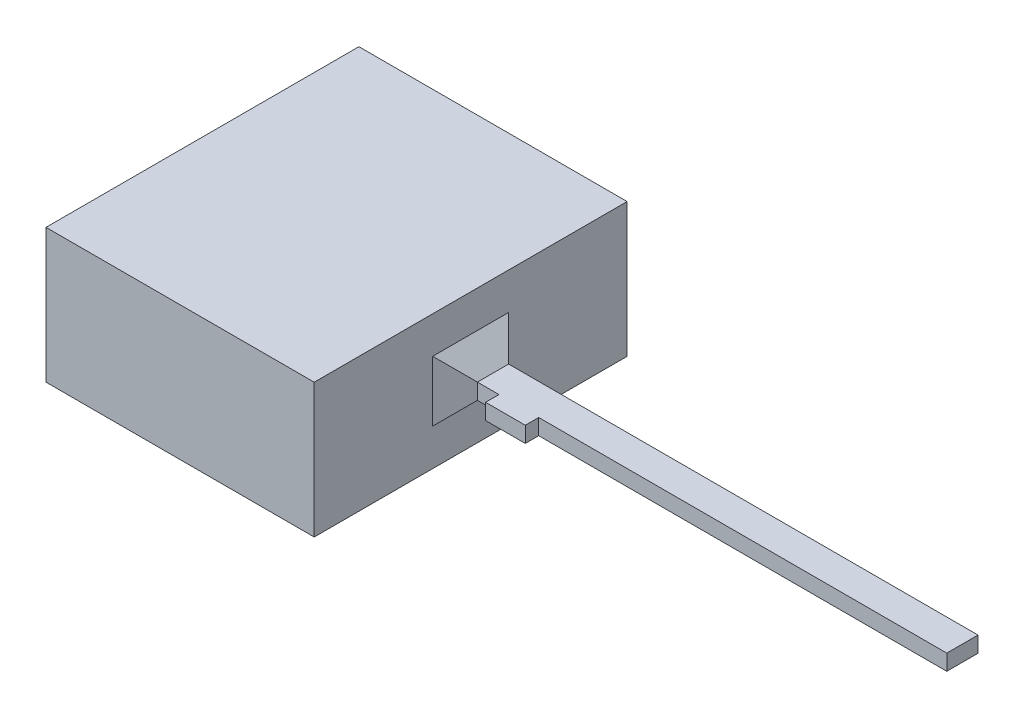
ISO-10303-21;
HEADER;
FILE_DESCRIPTION(('STEP AP214'),'2;1');
FILE_NAME('part.step','',(''),(''),'','','');
FILE_SCHEMA(('AUTOMOTIVE_DESIGN { 1 0 10303 214 1 1 1 1 }'));
ENDSEC;
DATA;
#1=APPLICATION_CONTEXT('core data for automotive mechanical design processes');
#2=APPLICATION_PROTOCOL_DEFINITION('international standard','automotive_design',2000,#1);
#3=PRODUCT_CONTEXT('',#1,'mechanical');
#4=PRODUCT('Part','Part','',(#3));
#5=PRODUCT_RELATED_PRODUCT_CATEGORY('part','',(#4));
#6=PRODUCT_DEFINITION_FORMATION('','',#4);
#7=PRODUCT_DEFINITION_CONTEXT('part definition',#1,'design');
#8=PRODUCT_DEFINITION('design','',#6,#7);
#9=PRODUCT_DEFINITION_SHAPE('','',#8);
#10=(LENGTH_UNIT() NAMED_UNIT(*) SI_UNIT(.MILLI.,.METRE.));
#11=(NAMED_UNIT(*) PLANE_ANGLE_UNIT() SI_UNIT($,.RADIAN.));
#12=(NAMED_UNIT(*) SI_UNIT($,.STERADIAN.) SOLID_ANGLE_UNIT());
#13=UNCERTAINTY_MEASURE_WITH_UNIT(LENGTH_MEASURE(1.E-05),#10,'distance_accuracy_value','');
#14=(GEOMETRIC_REPRESENTATION_CONTEXT(3) GLOBAL_UNCERTAINTY_ASSIGNED_CONTEXT((#13)) GLOBAL_UNIT_ASSIGNED_CONTEXT((#10,
#11,#12)) REPRESENTATION_CONTEXT('',''));
#15=CARTESIAN_POINT('',(0.,0.,0.));
#16=DIRECTION('',(0.,0.,1.));
#17=DIRECTION('',(1.,0.,0.));
#18=AXIS2_PLACEMENT_3D('',#15,#16,#17);
#19=CARTESIAN_POINT('',(14.,1.67667657759325,0.349313412928724));
#20=DIRECTION('',(0.,0.,-1.));
#21=DIRECTION('',(-1.,0.,0.));
#22=AXIS2_PLACEMENT_3D('',#19,#20,#21);
#23=PLANE('',#22);
#24=DIRECTION('',(0.,-1.,0.));
#25=VECTOR('',#24,1.);
#26=CARTESIAN_POINT('',(3.98275374954353,1.67667657759325,0.349313412928724));
#27=LINE('',#26,#25);
#28=CARTESIAN_POINT('',(3.98275374954353,1.67667657759325,0.349313412928724));
#29=VERTEX_POINT('',#28);
#30=CARTESIAN_POINT('',(3.98275374954353,1.32332342240675,0.349313412928724));
#31=VERTEX_POINT('',#30);
#32=EDGE_CURVE('E162',#29,#31,#27,.T.);
#33=ORIENTED_EDGE('',*,*,#32,.F.);
#34=DIRECTION('',(-1.,0.,0.));
#35=VECTOR('',#34,1.);
#36=CARTESIAN_POINT('',(14.,1.67667657759325,0.349313412928724));
#37=LINE('',#36,#35);
#38=CARTESIAN_POINT('',(3.5,1.67667657759325,0.349313412928724));
#39=VERTEX_POINT('',#38);
#40=EDGE_CURVE('E183',#29,#39,#37,.T.);
#41=ORIENTED_EDGE('',*,*,#40,.T.);
#42=DIRECTION('',(0.,-1.,0.));
#43=VECTOR('',#42,1.);
#44=CARTESIAN_POINT('',(3.5,1.32332342240675,0.349313412928724));
#45=LINE('',#44,#43);
#46=CARTESIAN_POINT('',(3.5,1.32332342240675,0.349313412928724));
#47=VERTEX_POINT('',#46);
#48=EDGE_CURVE('E200',#39,#47,#45,.T.);
#49=ORIENTED_EDGE('',*,*,#48,.T.);
#50=DIRECTION('',(-1.,0.,0.));
#51=VECTOR('',#50,1.);
#52=CARTESIAN_POINT('',(14.,1.32332342240675,0.349313412928724));
#53=LINE('',#52,#51);
#54=EDGE_CURVE('E50',#31,#47,#53,.T.);
#55=ORIENTED_EDGE('',*,*,#54,.F.);
#56=EDGE_LOOP('',(#33,#41,#49,#55));
#57=FACE_BOUND('',#56,.T.);
#58=ADVANCED_FACE('F33',(#57),#23,.F.);
#59=CARTESIAN_POINT('',(3.,3.,3.5));
#60=DIRECTION('',(-1.,0.,0.));
#61=DIRECTION('',(0.,0.,1.));
#62=AXIS2_PLACEMENT_3D('',#59,#60,#61);
#63=PLANE('',#62);
#64=DIRECTION('',(0.,0.,-1.));
#65=VECTOR('',#64,1.);
#66=CARTESIAN_POINT('',(3.,0.,3.5));
#67=LINE('',#66,#65);
#68=CARTESIAN_POINT('',(3.,0.,3.5));
#69=VERTEX_POINT('',#68);
#70=CARTESIAN_POINT('',(3.,0.,-3.5));
#71=VERTEX_POINT('',#70);
#72=EDGE_CURVE('E223',#69,#71,#67,.T.);
#73=ORIENTED_EDGE('',*,*,#72,.T.);
#74=DIRECTION('',(0.,-1.,0.));
#75=VECTOR('',#74,1.);
#76=CARTESIAN_POINT('',(3.,3.,-3.5));
#77=LINE('',#76,#75);
#78=CARTESIAN_POINT('',(3.,3.,-3.5));
#79=VERTEX_POINT('',#78);
#80=EDGE_CURVE('E228',#79,#71,#77,.T.);
#81=ORIENTED_EDGE('',*,*,#80,.F.);
#82=DIRECTION('',(0.,0.,-1.));
#83=VECTOR('',#82,1.);
#84=CARTESIAN_POINT('',(3.,3.,3.5));
#85=LINE('',#84,#83);
#86=CARTESIAN_POINT('',(3.,3.,3.5));
#87=VERTEX_POINT('',#86);
#88=EDGE_CURVE('E212',#87,#79,#85,.T.);
#89=ORIENTED_EDGE('',*,*,#88,.F.);
#90=DIRECTION('',(0.,-1.,0.));
#91=VECTOR('',#90,1.);
#92=CARTESIAN_POINT('',(3.,3.,3.5));
#93=LINE('',#92,#91);
#94=EDGE_CURVE('E42',#87,#69,#93,.T.);
#95=ORIENTED_EDGE('',*,*,#94,.T.);
#96=EDGE_LOOP('',(#73,#81,#89,#95));
#97=FACE_BOUND('',#96,.T.);
#98=DIRECTION('',(0.,-1.,0.));
#99=VECTOR('',#98,1.);
#100=CARTESIAN_POINT('',(3.,3.,-0.849313412928726));
#101=LINE('',#100,#99);
#102=CARTESIAN_POINT('',(3.,0.823323422406747,-0.849313412928726));
#103=VERTEX_POINT('',#102);
#104=CARTESIAN_POINT('',(3.,2.17667657759325,-0.849313412928726));
#105=VERTEX_POINT('',#104);
#106=EDGE_CURVE('E37',#103,#105,#101,.F.);
#107=ORIENTED_EDGE('',*,*,#106,.F.);
#108=DIRECTION('',(0.,0.,1.));
#109=VECTOR('',#108,1.);
#110=CARTESIAN_POINT('',(3.,0.823323422406747,3.5));
#111=LINE('',#110,#109);
#112=CARTESIAN_POINT('',(3.,0.823323422406747,0.849313412928726));
#113=VERTEX_POINT('',#112);
#114=EDGE_CURVE('E198',#113,#103,#111,.F.);
#115=ORIENTED_EDGE('',*,*,#114,.F.);
#116=DIRECTION('',(0.,1.,0.));
#117=VECTOR('',#116,1.);
#118=CARTESIAN_POINT('',(3.,3.,0.849313412928726));
#119=LINE('',#118,#117);
#120=CARTESIAN_POINT('',(3.,2.17667657759325,0.849313412928726));
#121=VERTEX_POINT('',#120);
#122=EDGE_CURVE('E245',#121,#113,#119,.F.);
#123=ORIENTED_EDGE('',*,*,#122,.F.);
#124=DIRECTION('',(0.,0.,-1.));
#125=VECTOR('',#124,1.);
#126=CARTESIAN_POINT('',(3.,2.17667657759325,3.5));
#127=LINE('',#126,#125);
#128=EDGE_CURVE('E247',#105,#121,#127,.F.);
#129=ORIENTED_EDGE('',*,*,#128,.F.);
#130=EDGE_LOOP('',(#107,#115,#123,#129));
#131=FACE_BOUND('',#130,.T.);
#132=ADVANCED_FACE('F256',(#97,#131),#63,.F.);
#133=CARTESIAN_POINT('',(-3.,3.,3.5));
#134=DIRECTION('',(1.,0.,0.));
#135=DIRECTION('',(0.,0.,-1.));
#136=AXIS2_PLACEMENT_3D('',#133,#134,#135);
#137=PLANE('',#136);
#138=DIRECTION('',(0.,0.,1.));
#139=VECTOR('',#138,1.);
#140=CARTESIAN_POINT('',(-3.,0.,3.5));
#141=LINE('',#140,#139);
#142=CARTESIAN_POINT('',(-3.,0.,-3.5));
#143=VERTEX_POINT('',#142);
#144=CARTESIAN_POINT('',(-3.,0.,3.5));
#145=VERTEX_POINT('',#144);
#146=EDGE_CURVE('E217',#143,#145,#141,.T.);
#147=ORIENTED_EDGE('',*,*,#146,.T.);
#148=DIRECTION('',(0.,-1.,0.));
#149=VECTOR('',#148,1.);
#150=CARTESIAN_POINT('',(-3.,3.,3.5));
#151=LINE('',#150,#149);
#152=CARTESIAN_POINT('',(-3.,3.,3.5));
#153=VERTEX_POINT('',#152);
#154=EDGE_CURVE('E11',#153,#145,#151,.T.);
#155=ORIENTED_EDGE('',*,*,#154,.F.);
#156=DIRECTION('',(0.,0.,1.));
#157=VECTOR('',#156,1.);
#158=CARTESIAN_POINT('',(-3.,3.,3.5));
#159=LINE('',#158,#157);
#160=CARTESIAN_POINT('',(-3.,3.,-3.5));
#161=VERTEX_POINT('',#160);
#162=EDGE_CURVE('E206',#161,#153,#159,.T.);
#163=ORIENTED_EDGE('',*,*,#162,.F.);
#164=DIRECTION('',(0.,-1.,0.));
#165=VECTOR('',#164,1.);
#166=CARTESIAN_POINT('',(-3.,3.,-3.5));
#167=LINE('',#166,#165);
#168=EDGE_CURVE('E216',#161,#143,#167,.T.);
#169=ORIENTED_EDGE('',*,*,#168,.T.);
#170=EDGE_LOOP('',(#147,#155,#163,#169));
#171=FACE_BOUND('',#170,.T.);
#172=ADVANCED_FACE('F282',(#171),#137,.F.);
#173=CARTESIAN_POINT('',(3.,3.,3.5));
#174=DIRECTION('',(0.,0.,-1.));
#175=DIRECTION('',(-1.,0.,0.));
#176=AXIS2_PLACEMENT_3D('',#173,#174,#175);
#177=PLANE('',#176);
#178=DIRECTION('',(1.,0.,0.));
#179=VECTOR('',#178,1.);
#180=CARTESIAN_POINT('',(3.,0.,3.5));
#181=LINE('',#180,#179);
#182=EDGE_CURVE('E220',#145,#69,#181,.T.);
#183=ORIENTED_EDGE('',*,*,#182,.T.);
#184=ORIENTED_EDGE('',*,*,#94,.F.);
#185=DIRECTION('',(1.,0.,0.));
#186=VECTOR('',#185,1.);
#187=CARTESIAN_POINT('',(3.,3.,3.5));
#188=LINE('',#187,#186);
#189=EDGE_CURVE('E209',#153,#87,#188,.T.);
#190=ORIENTED_EDGE('',*,*,#189,.F.);
#191=ORIENTED_EDGE('',*,*,#154,.T.);
#192=EDGE_LOOP('',(#183,#184,#190,#191));
#193=FACE_BOUND('',#192,.T.);
#194=ADVANCED_FACE('F417',(#193),#177,.F.);
#195=CARTESIAN_POINT('',(3.,3.,-3.5));
#196=DIRECTION('',(0.,0.,1.));
#197=DIRECTION('',(1.,0.,0.));
#198=AXIS2_PLACEMENT_3D('',#195,#196,#197);
#199=PLANE('',#198);
#200=DIRECTION('',(-1.,0.,0.));
#201=VECTOR('',#200,1.);
#202=CARTESIAN_POINT('',(3.,0.,-3.5));
#203=LINE('',#202,#201);
#204=EDGE_CURVE('E210',#71,#143,#203,.T.);
#205=ORIENTED_EDGE('',*,*,#204,.T.);
#206=ORIENTED_EDGE('',*,*,#168,.F.);
#207=DIRECTION('',(-1.,0.,0.));
#208=VECTOR('',#207,1.);
#209=CARTESIAN_POINT('',(3.,3.,-3.5));
#210=LINE('',#209,#208);
#211=EDGE_CURVE('E214',#79,#161,#210,.T.);
#212=ORIENTED_EDGE('',*,*,#211,.F.);
#213=ORIENTED_EDGE('',*,*,#80,.T.);
#214=EDGE_LOOP('',(#205,#206,#212,#213));
#215=FACE_BOUND('',#214,.T.);
#216=ADVANCED_FACE('F409',(#215),#199,.F.);
#217=CARTESIAN_POINT('',(0.,3.,0.));
#218=DIRECTION('',(0.,1.,0.));
#219=DIRECTION('',(0.,0.,1.));
#220=AXIS2_PLACEMENT_3D('',#217,#218,#219);
#221=PLANE('',#220);
#222=ORIENTED_EDGE('',*,*,#162,.T.);
#223=ORIENTED_EDGE('',*,*,#189,.T.);
#224=ORIENTED_EDGE('',*,*,#88,.T.);
#225=ORIENTED_EDGE('',*,*,#211,.T.);
#226=EDGE_LOOP('',(#222,#223,#224,#225));
#227=FACE_BOUND('',#226,.T.);
#228=ADVANCED_FACE('F400',(#227),#221,.T.);
#229=CARTESIAN_POINT('',(0.,0.,0.));
#230=DIRECTION('',(0.,1.,0.));
#231=DIRECTION('',(0.,0.,1.));
#232=AXIS2_PLACEMENT_3D('',#229,#230,#231);
#233=PLANE('',#232);
#234=ORIENTED_EDGE('',*,*,#146,.F.);
#235=ORIENTED_EDGE('',*,*,#204,.F.);
#236=ORIENTED_EDGE('',*,*,#72,.F.);
#237=ORIENTED_EDGE('',*,*,#182,.F.);
#238=EDGE_LOOP('',(#234,#235,#236,#237));
#239=FACE_BOUND('',#238,.T.);
#240=ADVANCED_FACE('F388',(#239),#233,.F.);
#241=CARTESIAN_POINT('',(3.5,1.32332342240675,-0.349313412928724));
#242=DIRECTION('',(0.707106781186549,0.,-0.707106781186546));
#243=DIRECTION('',(-0.707106781186546,0.,-0.707106781186549));
#244=AXIS2_PLACEMENT_3D('',#241,#242,#243);
#245=PLANE('',#244);
#246=ORIENTED_EDGE('',*,*,#106,.T.);
#247=DIRECTION('',(-0.577350269189624,0.577350269189627,-0.577350269189627));
#248=VECTOR('',#247,1.);
#249=CARTESIAN_POINT('',(3.73287560861915,1.4438009689741,-0.116437804309574));
#250=LINE('',#249,#248);
#251=CARTESIAN_POINT('',(3.5,1.67667657759325,-0.349313412928724));
#252=VERTEX_POINT('',#251);
#253=EDGE_CURVE('E221',#252,#105,#250,.T.);
#254=ORIENTED_EDGE('',*,*,#253,.F.);
#255=DIRECTION('',(0.,1.,0.));
#256=VECTOR('',#255,1.);
#257=CARTESIAN_POINT('',(3.5,1.32332342240675,-0.349313412928724));
#258=LINE('',#257,#256);
#259=CARTESIAN_POINT('',(3.5,1.32332342240675,-0.349313412928724));
#260=VERTEX_POINT('',#259);
#261=EDGE_CURVE('E194',#260,#252,#258,.T.);
#262=ORIENTED_EDGE('',*,*,#261,.F.);
#263=DIRECTION('',(-0.577350269189624,-0.577350269189627,-0.577350269189627));
#264=VECTOR('',#263,1.);
#265=CARTESIAN_POINT('',(3.5,1.32332342240675,-0.349313412928724));
#266=LINE('',#265,#264);
#267=EDGE_CURVE('E205',#260,#103,#266,.T.);
#268=ORIENTED_EDGE('',*,*,#267,.T.);
#269=EDGE_LOOP('',(#246,#254,#262,#268));
#270=FACE_BOUND('',#269,.T.);
#271=ADVANCED_FACE('F35',(#270),#245,.T.);
#272=CARTESIAN_POINT('',(3.5,1.67667657759325,0.349313412928724));
#273=DIRECTION('',(0.707106781186549,0.707106781186546,0.));
#274=DIRECTION('',(-0.707106781186546,0.707106781186549,0.));
#275=AXIS2_PLACEMENT_3D('',#272,#273,#274);
#276=PLANE('',#275);
#277=ORIENTED_EDGE('',*,*,#128,.T.);
#278=DIRECTION('',(-0.577350269189624,0.577350269189627,0.577350269189627));
#279=VECTOR('',#278,1.);
#280=CARTESIAN_POINT('',(3.61778438506217,1.55889219253108,0.231529027866556));
#281=LINE('',#280,#279);
#282=EDGE_CURVE('E238',#39,#121,#281,.T.);
#283=ORIENTED_EDGE('',*,*,#282,.F.);
#284=DIRECTION('',(0.,0.,1.));
#285=VECTOR('',#284,1.);
#286=CARTESIAN_POINT('',(3.5,1.67667657759325,0.349313412928724));
#287=LINE('',#286,#285);
#288=EDGE_CURVE('E197',#252,#39,#287,.T.);
#289=ORIENTED_EDGE('',*,*,#288,.F.);
#290=ORIENTED_EDGE('',*,*,#253,.T.);
#291=EDGE_LOOP('',(#277,#283,#289,#290));
#292=FACE_BOUND('',#291,.T.);
#293=ADVANCED_FACE('F264',(#292),#276,.T.);
#294=CARTESIAN_POINT('',(3.5,1.32332342240675,0.349313412928724));
#295=DIRECTION('',(0.707106781186549,0.,0.707106781186546));
#296=DIRECTION('',(0.707106781186546,0.,-0.707106781186549));
#297=AXIS2_PLACEMENT_3D('',#294,#295,#296);
#298=PLANE('',#297);
#299=ORIENTED_EDGE('',*,*,#122,.T.);
#300=DIRECTION('',(-0.577350269189624,-0.577350269189627,0.577350269189627));
#301=VECTOR('',#300,1.);
#302=CARTESIAN_POINT('',(3.5,1.32332342240675,0.349313412928724));
#303=LINE('',#302,#301);
#304=EDGE_CURVE('E235',#47,#113,#303,.T.);
#305=ORIENTED_EDGE('',*,*,#304,.F.);
#306=ORIENTED_EDGE('',*,*,#48,.F.);
#307=ORIENTED_EDGE('',*,*,#282,.T.);
#308=EDGE_LOOP('',(#299,#305,#306,#307));
#309=FACE_BOUND('',#308,.T.);
#310=ADVANCED_FACE('F263',(#309),#298,.T.);
#311=CARTESIAN_POINT('',(3.5,1.32332342240675,0.349313412928724));
#312=DIRECTION('',(0.707106781186549,-0.707106781186546,0.));
#313=DIRECTION('',(0.707106781186546,0.707106781186549,0.));
#314=AXIS2_PLACEMENT_3D('',#311,#312,#313);
#315=PLANE('',#314);
#316=ORIENTED_EDGE('',*,*,#114,.T.);
#317=ORIENTED_EDGE('',*,*,#267,.F.);
#318=DIRECTION('',(0.,0.,-1.));
#319=VECTOR('',#318,1.);
#320=CARTESIAN_POINT('',(3.5,1.32332342240675,0.349313412928724));
#321=LINE('',#320,#319);
#322=EDGE_CURVE('E202',#47,#260,#321,.T.);
#323=ORIENTED_EDGE('',*,*,#322,.F.);
#324=ORIENTED_EDGE('',*,*,#304,.T.);
#325=EDGE_LOOP('',(#316,#317,#323,#324));
#326=FACE_BOUND('',#325,.T.);
#327=ADVANCED_FACE('F258',(#326),#315,.T.);
#328=CARTESIAN_POINT('',(14.,1.67667657759325,0.349313412928724));
#329=VERTEX_POINT('',#328);
#330=CARTESIAN_POINT('',(4.87146021864883,1.67667657759325,0.349313412928724));
#331=VERTEX_POINT('',#330);
#332=EDGE_CURVE('E184',#329,#331,#37,.T.);
#333=ORIENTED_EDGE('',*,*,#332,.T.);
#334=DIRECTION('',(0.,-1.,0.));
#335=VECTOR('',#334,1.);
#336=CARTESIAN_POINT('',(4.87146021864883,1.67667657759325,0.349313412928724));
#337=LINE('',#336,#335);
#338=CARTESIAN_POINT('',(4.87146021864883,1.32332342240675,0.349313412928724));
#339=VERTEX_POINT('',#338);
#340=EDGE_CURVE('E58',#331,#339,#337,.T.);
#341=ORIENTED_EDGE('',*,*,#340,.T.);
#342=CARTESIAN_POINT('',(14.,1.32332342240675,0.349313412928724));
#343=VERTEX_POINT('',#342);
#344=EDGE_CURVE('E192',#343,#339,#53,.T.);
#345=ORIENTED_EDGE('',*,*,#344,.F.);
#346=DIRECTION('',(0.,-1.,0.));
#347=VECTOR('',#346,1.);
#348=CARTESIAN_POINT('',(14.,1.67667657759325,0.349313412928724));
#349=LINE('',#348,#347);
#350=EDGE_CURVE('E170',#329,#343,#349,.T.);
#351=ORIENTED_EDGE('',*,*,#350,.F.);
#352=EDGE_LOOP('',(#333,#341,#345,#351));
#353=FACE_BOUND('',#352,.T.);
#354=ADVANCED_FACE('F278',(#353),#23,.F.);
#355=CARTESIAN_POINT('',(14.,1.32332342240675,0.349313412928724));
#356=DIRECTION('',(0.,1.,0.));
#357=DIRECTION('',(0.,0.,1.));
#358=AXIS2_PLACEMENT_3D('',#355,#356,#357);
#359=PLANE('',#358);
#360=ORIENTED_EDGE('',*,*,#322,.T.);
#361=DIRECTION('',(-1.,0.,0.));
#362=VECTOR('',#361,1.);
#363=CARTESIAN_POINT('',(14.,1.32332342240675,-0.349313412928724));
#364=LINE('',#363,#362);
#365=CARTESIAN_POINT('',(14.,1.32332342240675,-0.349313412928724));
#366=VERTEX_POINT('',#365);
#367=EDGE_CURVE('E189',#366,#260,#364,.T.);
#368=ORIENTED_EDGE('',*,*,#367,.F.);
#369=DIRECTION('',(0.,0.,-1.));
#370=VECTOR('',#369,1.);
#371=CARTESIAN_POINT('',(14.,1.32332342240675,0.349313412928724));
#372=LINE('',#371,#370);
#373=EDGE_CURVE('E177',#343,#366,#372,.T.);
#374=ORIENTED_EDGE('',*,*,#373,.F.);
#375=ORIENTED_EDGE('',*,*,#344,.T.);
#376=DIRECTION('',(0.,0.,-1.));
#377=VECTOR('',#376,1.);
#378=CARTESIAN_POINT('',(4.87146021864883,1.32332342240675,0.649313412928724));
#379=LINE('',#378,#377);
#380=CARTESIAN_POINT('',(4.87146021864883,1.32332342240675,0.649313412928724));
#381=VERTEX_POINT('',#380);
#382=EDGE_CURVE('E146',#381,#339,#379,.T.);
#383=ORIENTED_EDGE('',*,*,#382,.F.);
#384=DIRECTION('',(1.,0.,0.));
#385=VECTOR('',#384,1.);
#386=CARTESIAN_POINT('',(3.98275374954353,1.32332342240675,0.649313412928724));
#387=LINE('',#386,#385);
#388=CARTESIAN_POINT('',(3.98275374954353,1.32332342240675,0.649313412928724));
#389=VERTEX_POINT('',#388);
#390=EDGE_CURVE('E154',#389,#381,#387,.T.);
#391=ORIENTED_EDGE('',*,*,#390,.F.);
#392=DIRECTION('',(0.,0.,-1.));
#393=VECTOR('',#392,1.);
#394=CARTESIAN_POINT('',(3.98275374954353,1.32332342240675,0.649313412928724));
#395=LINE('',#394,#393);
#396=EDGE_CURVE('E171',#389,#31,#395,.T.);
#397=ORIENTED_EDGE('',*,*,#396,.T.);
#398=ORIENTED_EDGE('',*,*,#54,.T.);
#399=EDGE_LOOP('',(#360,#368,#374,#375,#383,#391,#397,#398));
#400=FACE_BOUND('',#399,.T.);
#401=ADVANCED_FACE('F272',(#400),#359,.F.);
#402=CARTESIAN_POINT('',(14.,1.67667657759325,-0.349313412928724));
#403=DIRECTION('',(0.,0.,1.));
#404=DIRECTION('',(1.,0.,0.));
#405=AXIS2_PLACEMENT_3D('',#402,#403,#404);
#406=PLANE('',#405);
#407=ORIENTED_EDGE('',*,*,#261,.T.);
#408=DIRECTION('',(-1.,0.,0.));
#409=VECTOR('',#408,1.);
#410=CARTESIAN_POINT('',(14.,1.67667657759325,-0.349313412928724));
#411=LINE('',#410,#409);
#412=CARTESIAN_POINT('',(14.,1.67667657759325,-0.349313412928724));
#413=VERTEX_POINT('',#412);
#414=EDGE_CURVE('E186',#413,#252,#411,.T.);
#415=ORIENTED_EDGE('',*,*,#414,.F.);
#416=DIRECTION('',(0.,1.,0.));
#417=VECTOR('',#416,1.);
#418=CARTESIAN_POINT('',(14.,1.67667657759325,-0.349313412928724));
#419=LINE('',#418,#417);
#420=EDGE_CURVE('E179',#366,#413,#419,.T.);
#421=ORIENTED_EDGE('',*,*,#420,.F.);
#422=ORIENTED_EDGE('',*,*,#367,.T.);
#423=EDGE_LOOP('',(#407,#415,#421,#422));
#424=FACE_BOUND('',#423,.T.);
#425=ADVANCED_FACE('F269',(#424),#406,.F.);
#426=CARTESIAN_POINT('',(14.,1.67667657759325,0.349313412928724));
#427=DIRECTION('',(0.,-1.,0.));
#428=DIRECTION('',(0.,0.,-1.));
#429=AXIS2_PLACEMENT_3D('',#426,#427,#428);
#430=PLANE('',#429);
#431=ORIENTED_EDGE('',*,*,#288,.T.);
#432=ORIENTED_EDGE('',*,*,#40,.F.);
#433=DIRECTION('',(0.,0.,-1.));
#434=VECTOR('',#433,1.);
#435=CARTESIAN_POINT('',(3.98275374954353,1.67667657759325,0.649313412928724));
#436=LINE('',#435,#434);
#437=CARTESIAN_POINT('',(3.98275374954353,1.67667657759325,0.649313412928724));
#438=VERTEX_POINT('',#437);
#439=EDGE_CURVE('E160',#438,#29,#436,.T.);
#440=ORIENTED_EDGE('',*,*,#439,.F.);
#441=DIRECTION('',(1.,0.,0.));
#442=VECTOR('',#441,1.);
#443=CARTESIAN_POINT('',(3.98275374954353,1.67667657759325,0.649313412928724));
#444=LINE('',#443,#442);
#445=CARTESIAN_POINT('',(4.87146021864883,1.67667657759325,0.649313412928724));
#446=VERTEX_POINT('',#445);
#447=EDGE_CURVE('E152',#438,#446,#444,.T.);
#448=ORIENTED_EDGE('',*,*,#447,.T.);
#449=DIRECTION('',(0.,0.,-1.));
#450=VECTOR('',#449,1.);
#451=CARTESIAN_POINT('',(4.87146021864883,1.67667657759325,0.649313412928724));
#452=LINE('',#451,#450);
#453=EDGE_CURVE('E138',#446,#331,#452,.T.);
#454=ORIENTED_EDGE('',*,*,#453,.T.);
#455=ORIENTED_EDGE('',*,*,#332,.F.);
#456=DIRECTION('',(0.,0.,1.));
#457=VECTOR('',#456,1.);
#458=CARTESIAN_POINT('',(14.,1.67667657759325,0.349313412928724));
#459=LINE('',#458,#457);
#460=EDGE_CURVE('E181',#413,#329,#459,.T.);
#461=ORIENTED_EDGE('',*,*,#460,.F.);
#462=ORIENTED_EDGE('',*,*,#414,.T.);
#463=EDGE_LOOP('',(#431,#432,#440,#448,#454,#455,#461,#462));
#464=FACE_BOUND('',#463,.T.);
#465=ADVANCED_FACE('F158',(#464),#430,.F.);
#466=CARTESIAN_POINT('',(14.,0.,0.));
#467=DIRECTION('',(1.,0.,0.));
#468=DIRECTION('',(0.,0.,-1.));
#469=AXIS2_PLACEMENT_3D('',#466,#467,#468);
#470=PLANE('',#469);
#471=ORIENTED_EDGE('',*,*,#350,.T.);
#472=ORIENTED_EDGE('',*,*,#373,.T.);
#473=ORIENTED_EDGE('',*,*,#420,.T.);
#474=ORIENTED_EDGE('',*,*,#460,.T.);
#475=EDGE_LOOP('',(#471,#472,#473,#474));
#476=FACE_BOUND('',#475,.T.);
#477=ADVANCED_FACE('F295',(#476),#470,.T.);
#478=CARTESIAN_POINT('',(3.98275374954353,1.67667657759325,0.649313412928724));
#479=DIRECTION('',(1.,0.,0.));
#480=DIRECTION('',(0.,0.,-1.));
#481=AXIS2_PLACEMENT_3D('',#478,#479,#480);
#482=PLANE('',#481);
#483=ORIENTED_EDGE('',*,*,#32,.T.);
#484=ORIENTED_EDGE('',*,*,#396,.F.);
#485=DIRECTION('',(0.,-1.,0.));
#486=VECTOR('',#485,1.);
#487=CARTESIAN_POINT('',(3.98275374954353,1.67667657759325,0.649313412928724));
#488=LINE('',#487,#486);
#489=EDGE_CURVE('E147',#438,#389,#488,.T.);
#490=ORIENTED_EDGE('',*,*,#489,.F.);
#491=ORIENTED_EDGE('',*,*,#439,.T.);
#492=EDGE_LOOP('',(#483,#484,#490,#491));
#493=FACE_BOUND('',#492,.T.);
#494=ADVANCED_FACE('F275',(#493),#482,.F.);
#495=CARTESIAN_POINT('',(4.87146021864883,1.67667657759325,0.649313412928724));
#496=DIRECTION('',(1.,0.,0.));
#497=DIRECTION('',(0.,0.,-1.));
#498=AXIS2_PLACEMENT_3D('',#495,#496,#497);
#499=PLANE('',#498);
#500=ORIENTED_EDGE('',*,*,#340,.F.);
#501=ORIENTED_EDGE('',*,*,#453,.F.);
#502=DIRECTION('',(0.,-1.,0.));
#503=VECTOR('',#502,1.);
#504=CARTESIAN_POINT('',(4.87146021864883,1.67667657759325,0.649313412928724));
#505=LINE('',#504,#503);
#506=EDGE_CURVE('E142',#446,#381,#505,.T.);
#507=ORIENTED_EDGE('',*,*,#506,.T.);
#508=ORIENTED_EDGE('',*,*,#382,.T.);
#509=EDGE_LOOP('',(#500,#501,#507,#508));
#510=FACE_BOUND('',#509,.T.);
#511=ADVANCED_FACE('F140',(#510),#499,.T.);
#512=CARTESIAN_POINT('',(0.,0.,0.649313412928724));
#513=DIRECTION('',(0.,0.,-1.));
#514=DIRECTION('',(-1.,0.,0.));
#515=AXIS2_PLACEMENT_3D('',#512,#513,#514);
#516=PLANE('',#515);
#517=ORIENTED_EDGE('',*,*,#447,.F.);
#518=ORIENTED_EDGE('',*,*,#489,.T.);
#519=ORIENTED_EDGE('',*,*,#390,.T.);
#520=ORIENTED_EDGE('',*,*,#506,.F.);
#521=EDGE_LOOP('',(#517,#518,#519,#520));
#522=FACE_BOUND('',#521,.T.);
#523=ADVANCED_FACE('F151',(#522),#516,.F.);
#524=CLOSED_SHELL('',(#58,#132,#172,#194,#216,#228,#240,#271,#293,#310,#327,#354,#401,#425,#465,
#477,#494,#511,#523));
#525=MANIFOLD_SOLID_BREP('B2',#524);
#526=ADVANCED_BREP_SHAPE_REPRESENTATION('',(#18,#525),#14);
#527=SHAPE_DEFINITION_REPRESENTATION(#9,#526);
ENDSEC;
END-ISO-10303-21;
